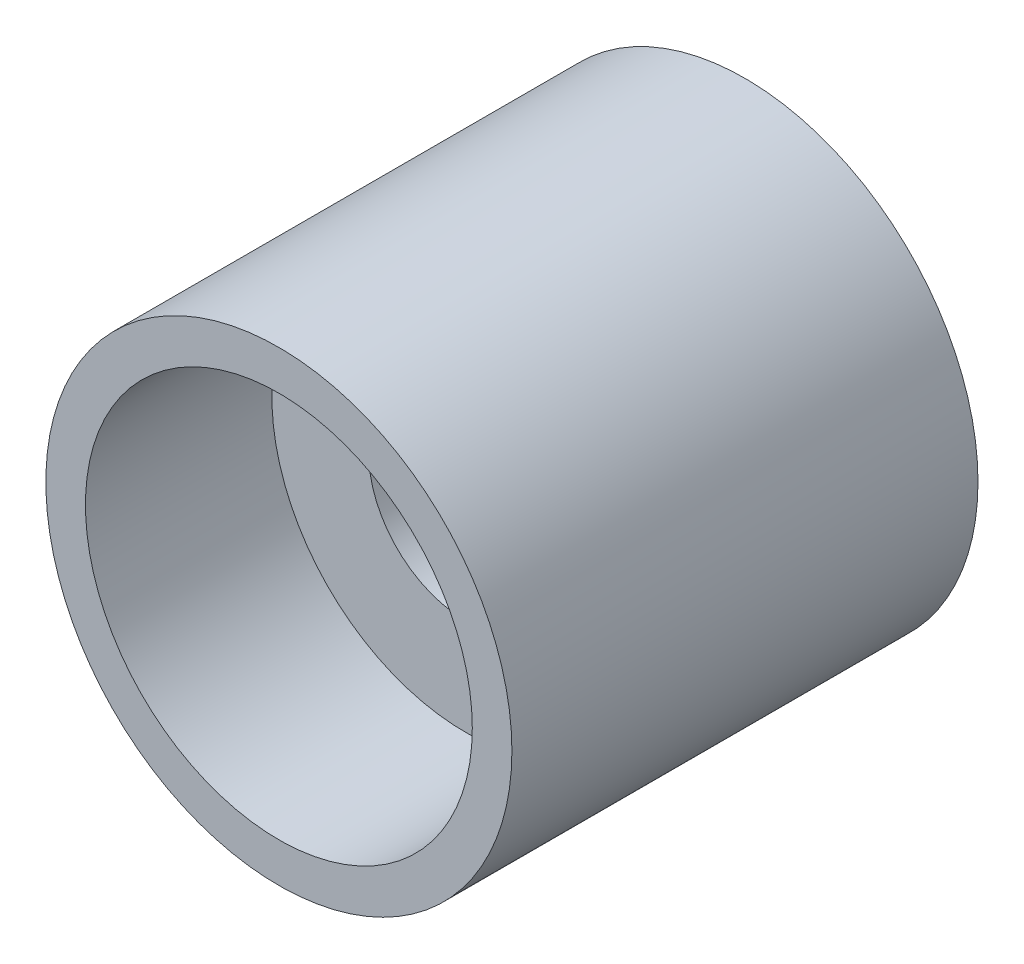
ISO-10303-21;
HEADER;
FILE_DESCRIPTION(('STEP AP214'),'2;1');
FILE_NAME('part.step','',(''),(''),'','','');
FILE_SCHEMA(('AUTOMOTIVE_DESIGN { 1 0 10303 214 1 1 1 1 }'));
ENDSEC;
DATA;
#1=APPLICATION_CONTEXT('core data for automotive mechanical design processes');
#2=APPLICATION_PROTOCOL_DEFINITION('international standard','automotive_design',2000,#1);
#3=PRODUCT_CONTEXT('',#1,'mechanical');
#4=PRODUCT('Part','Part','',(#3));
#5=PRODUCT_RELATED_PRODUCT_CATEGORY('part','',(#4));
#6=PRODUCT_DEFINITION_FORMATION('','',#4);
#7=PRODUCT_DEFINITION_CONTEXT('part definition',#1,'design');
#8=PRODUCT_DEFINITION('design','',#6,#7);
#9=PRODUCT_DEFINITION_SHAPE('','',#8);
#10=(LENGTH_UNIT() NAMED_UNIT(*) SI_UNIT(.MILLI.,.METRE.));
#11=(NAMED_UNIT(*) PLANE_ANGLE_UNIT() SI_UNIT($,.RADIAN.));
#12=(NAMED_UNIT(*) SI_UNIT($,.STERADIAN.) SOLID_ANGLE_UNIT());
#13=UNCERTAINTY_MEASURE_WITH_UNIT(LENGTH_MEASURE(1.E-05),#10,'distance_accuracy_value','');
#14=(GEOMETRIC_REPRESENTATION_CONTEXT(3) GLOBAL_UNCERTAINTY_ASSIGNED_CONTEXT((#13)) GLOBAL_UNIT_ASSIGNED_CONTEXT((#10,
#11,#12)) REPRESENTATION_CONTEXT('',''));
#15=CARTESIAN_POINT('',(0.,0.,0.));
#16=DIRECTION('',(0.,0.,1.));
#17=DIRECTION('',(1.,0.,0.));
#18=AXIS2_PLACEMENT_3D('',#15,#16,#17);
#19=CARTESIAN_POINT('',(0.,0.,20.));
#20=DIRECTION('',(0.,0.,-1.));
#21=DIRECTION('',(-1.,0.,0.));
#22=AXIS2_PLACEMENT_3D('',#19,#20,#21);
#23=CYLINDRICAL_SURFACE('',#22,4.15);
#24=CARTESIAN_POINT('',(0.,0.,0.));
#25=DIRECTION('',(0.,0.,1.));
#26=DIRECTION('',(1.,0.,0.));
#27=AXIS2_PLACEMENT_3D('',#24,#25,#26);
#28=CIRCLE('',#27,4.15);
#29=CARTESIAN_POINT('',(4.15,0.,0.));
#30=VERTEX_POINT('',#29);
#31=EDGE_CURVE('E44',#30,#30,#28,.T.);
#32=ORIENTED_EDGE('',*,*,#31,.F.);
#33=EDGE_LOOP('',(#32));
#34=FACE_BOUND('',#33,.T.);
#35=CARTESIAN_POINT('',(0.,0.,12.));
#36=DIRECTION('',(0.,0.,1.));
#37=DIRECTION('',(1.,0.,0.));
#38=AXIS2_PLACEMENT_3D('',#35,#36,#37);
#39=CIRCLE('',#38,4.15);
#40=CARTESIAN_POINT('',(4.15,0.,12.));
#41=VERTEX_POINT('',#40);
#42=EDGE_CURVE('E35',#41,#41,#39,.T.);
#43=ORIENTED_EDGE('',*,*,#42,.T.);
#44=EDGE_LOOP('',(#43));
#45=FACE_BOUND('',#44,.T.);
#46=ADVANCED_FACE('F31',(#34,#45),#23,.F.);
#47=CARTESIAN_POINT('',(0.,0.,20.));
#48=DIRECTION('',(0.,0.,1.));
#49=DIRECTION('',(1.,0.,0.));
#50=AXIS2_PLACEMENT_3D('',#47,#48,#49);
#51=PLANE('',#50);
#52=CARTESIAN_POINT('',(0.,0.,20.));
#53=DIRECTION('',(0.,0.,1.));
#54=DIRECTION('',(1.,0.,0.));
#55=AXIS2_PLACEMENT_3D('',#52,#53,#54);
#56=CIRCLE('',#55,8.3);
#57=CARTESIAN_POINT('',(8.3,0.,20.));
#58=VERTEX_POINT('',#57);
#59=EDGE_CURVE('E48',#58,#58,#56,.T.);
#60=ORIENTED_EDGE('',*,*,#59,.F.);
#61=EDGE_LOOP('',(#60));
#62=FACE_BOUND('',#61,.T.);
#63=CARTESIAN_POINT('',(0.,0.,20.));
#64=DIRECTION('',(0.,0.,1.));
#65=DIRECTION('',(1.,0.,0.));
#66=AXIS2_PLACEMENT_3D('',#63,#64,#65);
#67=CIRCLE('',#66,10.);
#68=CARTESIAN_POINT('',(10.,0.,20.));
#69=VERTEX_POINT('',#68);
#70=EDGE_CURVE('E10',#69,#69,#67,.T.);
#71=ORIENTED_EDGE('',*,*,#70,.T.);
#72=EDGE_LOOP('',(#71));
#73=FACE_BOUND('',#72,.T.);
#74=ADVANCED_FACE('F69',(#62,#73),#51,.T.);
#75=CARTESIAN_POINT('',(0.,0.,0.));
#76=DIRECTION('',(0.,0.,1.));
#77=DIRECTION('',(1.,0.,0.));
#78=AXIS2_PLACEMENT_3D('',#75,#76,#77);
#79=PLANE('',#78);
#80=CARTESIAN_POINT('',(0.,0.,0.));
#81=DIRECTION('',(0.,0.,1.));
#82=DIRECTION('',(1.,0.,0.));
#83=AXIS2_PLACEMENT_3D('',#80,#81,#82);
#84=CIRCLE('',#83,10.);
#85=CARTESIAN_POINT('',(10.,0.,0.));
#86=VERTEX_POINT('',#85);
#87=EDGE_CURVE('E39',#86,#86,#84,.T.);
#88=ORIENTED_EDGE('',*,*,#87,.F.);
#89=EDGE_LOOP('',(#88));
#90=FACE_BOUND('',#89,.T.);
#91=ORIENTED_EDGE('',*,*,#31,.T.);
#92=EDGE_LOOP('',(#91));
#93=FACE_BOUND('',#92,.T.);
#94=ADVANCED_FACE('F75',(#90,#93),#79,.F.);
#95=CARTESIAN_POINT('',(0.,0.,20.));
#96=DIRECTION('',(0.,0.,-1.));
#97=DIRECTION('',(-1.,0.,0.));
#98=AXIS2_PLACEMENT_3D('',#95,#96,#97);
#99=CYLINDRICAL_SURFACE('',#98,10.);
#100=ORIENTED_EDGE('',*,*,#70,.F.);
#101=EDGE_LOOP('',(#100));
#102=FACE_BOUND('',#101,.T.);
#103=ORIENTED_EDGE('',*,*,#87,.T.);
#104=EDGE_LOOP('',(#103));
#105=FACE_BOUND('',#104,.T.);
#106=ADVANCED_FACE('F33',(#102,#105),#99,.T.);
#107=CARTESIAN_POINT('',(0.,0.,12.));
#108=DIRECTION('',(0.,0.,1.));
#109=DIRECTION('',(1.,0.,0.));
#110=AXIS2_PLACEMENT_3D('',#107,#108,#109);
#111=CYLINDRICAL_SURFACE('',#110,8.3);
#112=CARTESIAN_POINT('',(0.,0.,12.));
#113=DIRECTION('',(0.,0.,1.));
#114=DIRECTION('',(1.,0.,0.));
#115=AXIS2_PLACEMENT_3D('',#112,#113,#114);
#116=CIRCLE('',#115,8.3);
#117=CARTESIAN_POINT('',(8.3,0.,12.));
#118=VERTEX_POINT('',#117);
#119=EDGE_CURVE('E51',#118,#118,#116,.T.);
#120=ORIENTED_EDGE('',*,*,#119,.F.);
#121=EDGE_LOOP('',(#120));
#122=FACE_BOUND('',#121,.T.);
#123=ORIENTED_EDGE('',*,*,#59,.T.);
#124=EDGE_LOOP('',(#123));
#125=FACE_BOUND('',#124,.T.);
#126=ADVANCED_FACE('F61',(#122,#125),#111,.F.);
#127=CARTESIAN_POINT('',(0.,0.,12.));
#128=DIRECTION('',(0.,0.,1.));
#129=DIRECTION('',(1.,0.,0.));
#130=AXIS2_PLACEMENT_3D('',#127,#128,#129);
#131=PLANE('',#130);
#132=ORIENTED_EDGE('',*,*,#42,.F.);
#133=EDGE_LOOP('',(#132));
#134=FACE_BOUND('',#133,.T.);
#135=ORIENTED_EDGE('',*,*,#119,.T.);
#136=EDGE_LOOP('',(#135));
#137=FACE_BOUND('',#136,.T.);
#138=ADVANCED_FACE('F59',(#134,#137),#131,.T.);
#139=CLOSED_SHELL('',(#46,#74,#94,#106,#126,#138));
#140=MANIFOLD_SOLID_BREP('B2',#139);
#141=ADVANCED_BREP_SHAPE_REPRESENTATION('',(#18,#140),#14);
#142=SHAPE_DEFINITION_REPRESENTATION(#9,#141);
ENDSEC;
END-ISO-10303-21;
